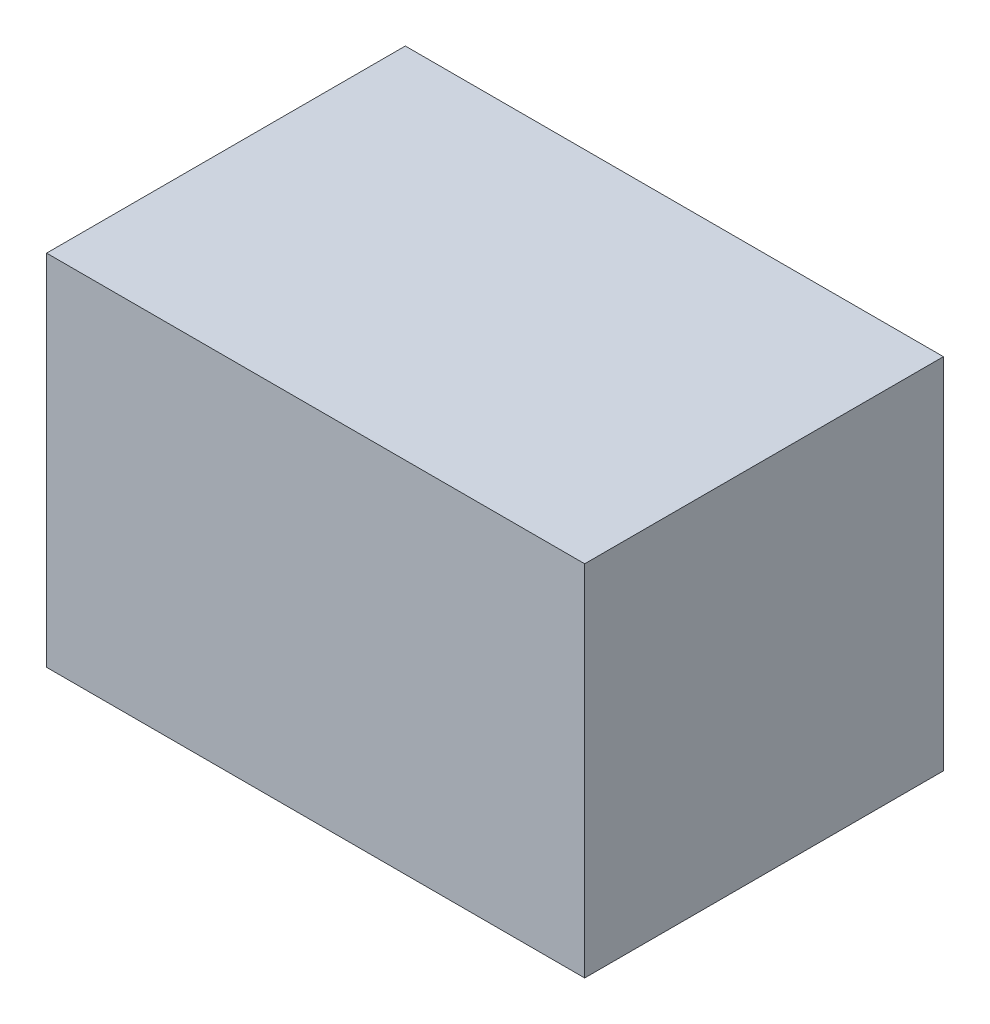
ISO-10303-21;
HEADER;
FILE_DESCRIPTION(('STEP AP214'),'2;1');
FILE_NAME('part.step','',(''),(''),'','','');
FILE_SCHEMA(('AUTOMOTIVE_DESIGN { 1 0 10303 214 1 1 1 1 }'));
ENDSEC;
DATA;
#1=APPLICATION_CONTEXT('core data for automotive mechanical design processes');
#2=APPLICATION_PROTOCOL_DEFINITION('international standard','automotive_design',2000,#1);
#3=PRODUCT_CONTEXT('',#1,'mechanical');
#4=PRODUCT('Part','Part','',(#3));
#5=PRODUCT_RELATED_PRODUCT_CATEGORY('part','',(#4));
#6=PRODUCT_DEFINITION_FORMATION('','',#4);
#7=PRODUCT_DEFINITION_CONTEXT('part definition',#1,'design');
#8=PRODUCT_DEFINITION('design','',#6,#7);
#9=PRODUCT_DEFINITION_SHAPE('','',#8);
#10=(LENGTH_UNIT() NAMED_UNIT(*) SI_UNIT(.MILLI.,.METRE.));
#11=(NAMED_UNIT(*) PLANE_ANGLE_UNIT() SI_UNIT($,.RADIAN.));
#12=(NAMED_UNIT(*) SI_UNIT($,.STERADIAN.) SOLID_ANGLE_UNIT());
#13=UNCERTAINTY_MEASURE_WITH_UNIT(LENGTH_MEASURE(1.E-05),#10,'distance_accuracy_value','');
#14=(GEOMETRIC_REPRESENTATION_CONTEXT(3) GLOBAL_UNCERTAINTY_ASSIGNED_CONTEXT((#13)) GLOBAL_UNIT_ASSIGNED_CONTEXT((#10,
#11,#12)) REPRESENTATION_CONTEXT('',''));
#15=CARTESIAN_POINT('',(0.,0.,0.));
#16=DIRECTION('',(0.,0.,1.));
#17=DIRECTION('',(1.,0.,0.));
#18=AXIS2_PLACEMENT_3D('',#15,#16,#17);
#19=CARTESIAN_POINT('',(-67.5,90.,45.));
#20=DIRECTION('',(1.,0.,0.));
#21=DIRECTION('',(0.,0.,-1.));
#22=AXIS2_PLACEMENT_3D('',#19,#20,#21);
#23=PLANE('',#22);
#24=DIRECTION('',(0.,0.,1.));
#25=VECTOR('',#24,1.);
#26=CARTESIAN_POINT('',(-67.5,0.,45.));
#27=LINE('',#26,#25);
#28=CARTESIAN_POINT('',(-67.5,0.,-45.));
#29=VERTEX_POINT('',#28);
#30=CARTESIAN_POINT('',(-67.5,0.,45.));
#31=VERTEX_POINT('',#30);
#32=EDGE_CURVE('E102',#29,#31,#27,.T.);
#33=ORIENTED_EDGE('',*,*,#32,.T.);
#34=DIRECTION('',(0.,-1.,0.));
#35=VECTOR('',#34,1.);
#36=CARTESIAN_POINT('',(-67.5,90.,45.));
#37=LINE('',#36,#35);
#38=CARTESIAN_POINT('',(-67.5,90.,45.));
#39=VERTEX_POINT('',#38);
#40=EDGE_CURVE('E11',#39,#31,#37,.T.);
#41=ORIENTED_EDGE('',*,*,#40,.F.);
#42=DIRECTION('',(0.,0.,1.));
#43=VECTOR('',#42,1.);
#44=CARTESIAN_POINT('',(-67.5,90.,45.));
#45=LINE('',#44,#43);
#46=CARTESIAN_POINT('',(-67.5,90.,-45.));
#47=VERTEX_POINT('',#46);
#48=EDGE_CURVE('E90',#47,#39,#45,.T.);
#49=ORIENTED_EDGE('',*,*,#48,.F.);
#50=DIRECTION('',(0.,-1.,0.));
#51=VECTOR('',#50,1.);
#52=CARTESIAN_POINT('',(-67.5,90.,-45.));
#53=LINE('',#52,#51);
#54=EDGE_CURVE('E98',#47,#29,#53,.T.);
#55=ORIENTED_EDGE('',*,*,#54,.T.);
#56=EDGE_LOOP('',(#33,#41,#49,#55));
#57=FACE_BOUND('',#56,.T.);
#58=ADVANCED_FACE('F39',(#57),#23,.F.);
#59=CARTESIAN_POINT('',(67.5,90.,45.));
#60=DIRECTION('',(0.,0.,-1.));
#61=DIRECTION('',(-1.,0.,0.));
#62=AXIS2_PLACEMENT_3D('',#59,#60,#61);
#63=PLANE('',#62);
#64=DIRECTION('',(1.,0.,0.));
#65=VECTOR('',#64,1.);
#66=CARTESIAN_POINT('',(67.5,0.,45.));
#67=LINE('',#66,#65);
#68=CARTESIAN_POINT('',(67.5,0.,45.));
#69=VERTEX_POINT('',#68);
#70=EDGE_CURVE('E94',#31,#69,#67,.T.);
#71=ORIENTED_EDGE('',*,*,#70,.T.);
#72=DIRECTION('',(0.,-1.,0.));
#73=VECTOR('',#72,1.);
#74=CARTESIAN_POINT('',(67.5,90.,45.));
#75=LINE('',#74,#73);
#76=CARTESIAN_POINT('',(67.5,90.,45.));
#77=VERTEX_POINT('',#76);
#78=EDGE_CURVE('E47',#77,#69,#75,.T.);
#79=ORIENTED_EDGE('',*,*,#78,.F.);
#80=DIRECTION('',(1.,0.,0.));
#81=VECTOR('',#80,1.);
#82=CARTESIAN_POINT('',(67.5,90.,45.));
#83=LINE('',#82,#81);
#84=EDGE_CURVE('E85',#39,#77,#83,.T.);
#85=ORIENTED_EDGE('',*,*,#84,.F.);
#86=ORIENTED_EDGE('',*,*,#40,.T.);
#87=EDGE_LOOP('',(#71,#79,#85,#86));
#88=FACE_BOUND('',#87,.T.);
#89=ADVANCED_FACE('F93',(#88),#63,.F.);
#90=CARTESIAN_POINT('',(67.5,90.,45.));
#91=DIRECTION('',(-1.,0.,0.));
#92=DIRECTION('',(0.,0.,1.));
#93=AXIS2_PLACEMENT_3D('',#90,#91,#92);
#94=PLANE('',#93);
#95=DIRECTION('',(0.,0.,-1.));
#96=VECTOR('',#95,1.);
#97=CARTESIAN_POINT('',(67.5,0.,45.));
#98=LINE('',#97,#96);
#99=CARTESIAN_POINT('',(67.5,0.,-45.));
#100=VERTEX_POINT('',#99);
#101=EDGE_CURVE('E72',#69,#100,#98,.T.);
#102=ORIENTED_EDGE('',*,*,#101,.T.);
#103=DIRECTION('',(0.,-1.,0.));
#104=VECTOR('',#103,1.);
#105=CARTESIAN_POINT('',(67.5,90.,-45.));
#106=LINE('',#105,#104);
#107=CARTESIAN_POINT('',(67.5,90.,-45.));
#108=VERTEX_POINT('',#107);
#109=EDGE_CURVE('E95',#108,#100,#106,.T.);
#110=ORIENTED_EDGE('',*,*,#109,.F.);
#111=DIRECTION('',(0.,0.,-1.));
#112=VECTOR('',#111,1.);
#113=CARTESIAN_POINT('',(67.5,90.,45.));
#114=LINE('',#113,#112);
#115=EDGE_CURVE('E88',#77,#108,#114,.T.);
#116=ORIENTED_EDGE('',*,*,#115,.F.);
#117=ORIENTED_EDGE('',*,*,#78,.T.);
#118=EDGE_LOOP('',(#102,#110,#116,#117));
#119=FACE_BOUND('',#118,.T.);
#120=ADVANCED_FACE('F96',(#119),#94,.F.);
#121=CARTESIAN_POINT('',(67.5,90.,-45.));
#122=DIRECTION('',(0.,0.,1.));
#123=DIRECTION('',(1.,0.,0.));
#124=AXIS2_PLACEMENT_3D('',#121,#122,#123);
#125=PLANE('',#124);
#126=DIRECTION('',(-1.,0.,0.));
#127=VECTOR('',#126,1.);
#128=CARTESIAN_POINT('',(67.5,0.,-45.));
#129=LINE('',#128,#127);
#130=EDGE_CURVE('E78',#100,#29,#129,.T.);
#131=ORIENTED_EDGE('',*,*,#130,.T.);
#132=ORIENTED_EDGE('',*,*,#54,.F.);
#133=DIRECTION('',(-1.,0.,0.));
#134=VECTOR('',#133,1.);
#135=CARTESIAN_POINT('',(67.5,90.,-45.));
#136=LINE('',#135,#134);
#137=EDGE_CURVE('E55',#108,#47,#136,.T.);
#138=ORIENTED_EDGE('',*,*,#137,.F.);
#139=ORIENTED_EDGE('',*,*,#109,.T.);
#140=EDGE_LOOP('',(#131,#132,#138,#139));
#141=FACE_BOUND('',#140,.T.);
#142=ADVANCED_FACE('F109',(#141),#125,.F.);
#143=CARTESIAN_POINT('',(0.,90.,0.));
#144=DIRECTION('',(0.,1.,0.));
#145=DIRECTION('',(0.,0.,1.));
#146=AXIS2_PLACEMENT_3D('',#143,#144,#145);
#147=PLANE('',#146);
#148=ORIENTED_EDGE('',*,*,#48,.T.);
#149=ORIENTED_EDGE('',*,*,#84,.T.);
#150=ORIENTED_EDGE('',*,*,#115,.T.);
#151=ORIENTED_EDGE('',*,*,#137,.T.);
#152=EDGE_LOOP('',(#148,#149,#150,#151));
#153=FACE_BOUND('',#152,.T.);
#154=ADVANCED_FACE('F86',(#153),#147,.T.);
#155=CARTESIAN_POINT('',(0.,0.,0.));
#156=DIRECTION('',(0.,1.,0.));
#157=DIRECTION('',(0.,0.,1.));
#158=AXIS2_PLACEMENT_3D('',#155,#156,#157);
#159=PLANE('',#158);
#160=ORIENTED_EDGE('',*,*,#32,.F.);
#161=ORIENTED_EDGE('',*,*,#130,.F.);
#162=ORIENTED_EDGE('',*,*,#101,.F.);
#163=ORIENTED_EDGE('',*,*,#70,.F.);
#164=EDGE_LOOP('',(#160,#161,#162,#163));
#165=FACE_BOUND('',#164,.T.);
#166=ADVANCED_FACE('F112',(#165),#159,.F.);
#167=CLOSED_SHELL('',(#58,#89,#120,#142,#154,#166));
#168=MANIFOLD_SOLID_BREP('B2',#167);
#169=ADVANCED_BREP_SHAPE_REPRESENTATION('',(#18,#168),#14);
#170=SHAPE_DEFINITION_REPRESENTATION(#9,#169);
ENDSEC;
END-ISO-10303-21;
